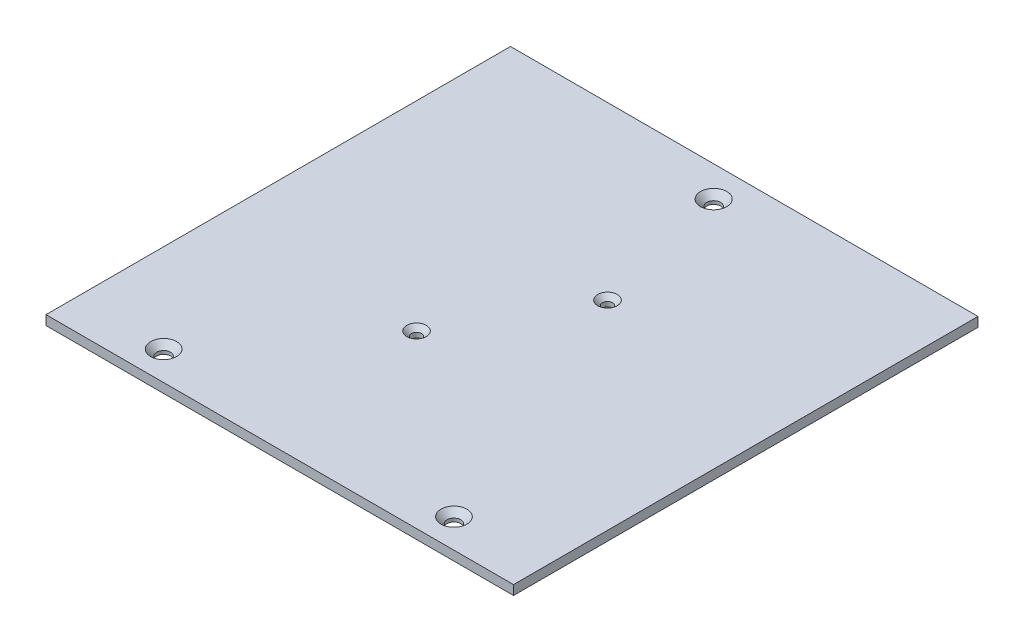
ISO-10303-21;
HEADER;
FILE_DESCRIPTION(('STEP AP214'),'2;1');
FILE_NAME('part.step','',(''),(''),'','','');
FILE_SCHEMA(('AUTOMOTIVE_DESIGN { 1 0 10303 214 1 1 1 1 }'));
ENDSEC;
DATA;
#1=APPLICATION_CONTEXT('core data for automotive mechanical design processes');
#2=APPLICATION_PROTOCOL_DEFINITION('international standard','automotive_design',2000,#1);
#3=PRODUCT_CONTEXT('',#1,'mechanical');
#4=PRODUCT('Part','Part','',(#3));
#5=PRODUCT_RELATED_PRODUCT_CATEGORY('part','',(#4));
#6=PRODUCT_DEFINITION_FORMATION('','',#4);
#7=PRODUCT_DEFINITION_CONTEXT('part definition',#1,'design');
#8=PRODUCT_DEFINITION('design','',#6,#7);
#9=PRODUCT_DEFINITION_SHAPE('','',#8);
#10=(LENGTH_UNIT() NAMED_UNIT(*) SI_UNIT(.MILLI.,.METRE.));
#11=(NAMED_UNIT(*) PLANE_ANGLE_UNIT() SI_UNIT($,.RADIAN.));
#12=(NAMED_UNIT(*) SI_UNIT($,.STERADIAN.) SOLID_ANGLE_UNIT());
#13=UNCERTAINTY_MEASURE_WITH_UNIT(LENGTH_MEASURE(1.E-05),#10,'distance_accuracy_value','');
#14=(GEOMETRIC_REPRESENTATION_CONTEXT(3) GLOBAL_UNCERTAINTY_ASSIGNED_CONTEXT((#13)) GLOBAL_UNIT_ASSIGNED_CONTEXT((#10,
#11,#12)) REPRESENTATION_CONTEXT('',''));
#15=CARTESIAN_POINT('',(0.,0.,0.));
#16=DIRECTION('',(0.,0.,1.));
#17=DIRECTION('',(1.,0.,0.));
#18=AXIS2_PLACEMENT_3D('',#15,#16,#17);
#19=CARTESIAN_POINT('',(0.,0.,0.));
#20=DIRECTION('',(0.,1.,0.));
#21=DIRECTION('',(1.,0.,0.));
#22=AXIS2_PLACEMENT_3D('',#19,#20,#21);
#23=PLANE('',#22);
#24=DIRECTION('',(-1.,0.,0.));
#25=VECTOR('',#24,1.);
#26=CARTESIAN_POINT('',(76.5,0.,-76.));
#27=LINE('',#26,#25);
#28=CARTESIAN_POINT('',(76.5,0.,-76.));
#29=VERTEX_POINT('',#28);
#30=CARTESIAN_POINT('',(-76.5,0.,-76.));
#31=VERTEX_POINT('',#30);
#32=EDGE_CURVE('E192',#29,#31,#27,.T.);
#33=ORIENTED_EDGE('',*,*,#32,.F.);
#34=DIRECTION('',(0.,0.,-1.));
#35=VECTOR('',#34,1.);
#36=CARTESIAN_POINT('',(76.5,0.,76.));
#37=LINE('',#36,#35);
#38=CARTESIAN_POINT('',(76.5,0.,76.));
#39=VERTEX_POINT('',#38);
#40=EDGE_CURVE('E36',#39,#29,#37,.T.);
#41=ORIENTED_EDGE('',*,*,#40,.F.);
#42=DIRECTION('',(1.,0.,0.));
#43=VECTOR('',#42,1.);
#44=CARTESIAN_POINT('',(-76.5,0.,76.));
#45=LINE('',#44,#43);
#46=CARTESIAN_POINT('',(-76.5,0.,76.));
#47=VERTEX_POINT('',#46);
#48=EDGE_CURVE('E74',#47,#39,#45,.T.);
#49=ORIENTED_EDGE('',*,*,#48,.F.);
#50=DIRECTION('',(0.,0.,1.));
#51=VECTOR('',#50,1.);
#52=CARTESIAN_POINT('',(-76.5,0.,-76.));
#53=LINE('',#52,#51);
#54=EDGE_CURVE('E188',#31,#47,#53,.T.);
#55=ORIENTED_EDGE('',*,*,#54,.F.);
#56=EDGE_LOOP('',(#33,#41,#49,#55));
#57=FACE_BOUND('',#56,.T.);
#58=CARTESIAN_POINT('',(47.5,0.,66.5));
#59=DIRECTION('',(0.,1.,0.));
#60=DIRECTION('',(-1.,0.,0.));
#61=AXIS2_PLACEMENT_3D('',#58,#59,#60);
#62=CIRCLE('',#61,2.25);
#63=CARTESIAN_POINT('',(45.25,0.,66.5));
#64=VERTEX_POINT('',#63);
#65=EDGE_CURVE('E11',#64,#64,#62,.T.);
#66=ORIENTED_EDGE('',*,*,#65,.T.);
#67=EDGE_LOOP('',(#66));
#68=FACE_BOUND('',#67,.T.);
#69=CARTESIAN_POINT('',(-47.5,0.,66.5));
#70=DIRECTION('',(0.,1.,0.));
#71=DIRECTION('',(-1.,0.,0.));
#72=AXIS2_PLACEMENT_3D('',#69,#70,#71);
#73=CIRCLE('',#72,2.25);
#74=CARTESIAN_POINT('',(-49.75,0.,66.5));
#75=VERTEX_POINT('',#74);
#76=EDGE_CURVE('E27',#75,#75,#73,.T.);
#77=ORIENTED_EDGE('',*,*,#76,.T.);
#78=EDGE_LOOP('',(#77));
#79=FACE_BOUND('',#78,.T.);
#80=CARTESIAN_POINT('',(0.,0.,-66.));
#81=DIRECTION('',(0.,1.,0.));
#82=DIRECTION('',(-1.,0.,0.));
#83=AXIS2_PLACEMENT_3D('',#80,#81,#82);
#84=CIRCLE('',#83,2.25);
#85=CARTESIAN_POINT('',(-2.25,0.,-66.));
#86=VERTEX_POINT('',#85);
#87=EDGE_CURVE('E174',#86,#86,#84,.T.);
#88=ORIENTED_EDGE('',*,*,#87,.T.);
#89=EDGE_LOOP('',(#88));
#90=FACE_BOUND('',#89,.T.);
#91=CARTESIAN_POINT('',(11.25,0.,-20.));
#92=DIRECTION('',(0.,1.,0.));
#93=DIRECTION('',(-1.,0.,0.));
#94=AXIS2_PLACEMENT_3D('',#91,#92,#93);
#95=CIRCLE('',#94,1.65);
#96=CARTESIAN_POINT('',(9.6,0.,-20.));
#97=VERTEX_POINT('',#96);
#98=EDGE_CURVE('E176',#97,#97,#95,.T.);
#99=ORIENTED_EDGE('',*,*,#98,.T.);
#100=EDGE_LOOP('',(#99));
#101=FACE_BOUND('',#100,.T.);
#102=CARTESIAN_POINT('',(-11.25,0.,20.));
#103=DIRECTION('',(0.,1.,0.));
#104=DIRECTION('',(-1.,0.,0.));
#105=AXIS2_PLACEMENT_3D('',#102,#103,#104);
#106=CIRCLE('',#105,1.65);
#107=CARTESIAN_POINT('',(-12.9,0.,20.));
#108=VERTEX_POINT('',#107);
#109=EDGE_CURVE('E181',#108,#108,#106,.T.);
#110=ORIENTED_EDGE('',*,*,#109,.T.);
#111=EDGE_LOOP('',(#110));
#112=FACE_BOUND('',#111,.T.);
#113=ADVANCED_FACE('F17',(#57,#68,#79,#90,#101,#112),#23,.F.);
#114=CARTESIAN_POINT('',(-76.5,0.,-76.));
#115=DIRECTION('',(-1.,0.,0.));
#116=DIRECTION('',(0.,0.,1.));
#117=AXIS2_PLACEMENT_3D('',#114,#115,#116);
#118=PLANE('',#117);
#119=DIRECTION('',(0.,1.,0.));
#120=VECTOR('',#119,1.);
#121=CARTESIAN_POINT('',(-76.5,0.,76.));
#122=LINE('',#121,#120);
#123=CARTESIAN_POINT('',(-76.5,3.1,76.));
#124=VERTEX_POINT('',#123);
#125=EDGE_CURVE('E186',#47,#124,#122,.T.);
#126=ORIENTED_EDGE('',*,*,#125,.T.);
#127=DIRECTION('',(0.,0.,1.));
#128=VECTOR('',#127,1.);
#129=CARTESIAN_POINT('',(-76.5,3.1,-76.));
#130=LINE('',#129,#128);
#131=CARTESIAN_POINT('',(-76.5,3.1,-76.));
#132=VERTEX_POINT('',#131);
#133=EDGE_CURVE('E78',#132,#124,#130,.T.);
#134=ORIENTED_EDGE('',*,*,#133,.F.);
#135=DIRECTION('',(0.,1.,0.));
#136=VECTOR('',#135,1.);
#137=CARTESIAN_POINT('',(-76.5,0.,-76.));
#138=LINE('',#137,#136);
#139=EDGE_CURVE('E190',#31,#132,#138,.T.);
#140=ORIENTED_EDGE('',*,*,#139,.F.);
#141=ORIENTED_EDGE('',*,*,#54,.T.);
#142=EDGE_LOOP('',(#126,#134,#140,#141));
#143=FACE_BOUND('',#142,.T.);
#144=ADVANCED_FACE('F129',(#143),#118,.T.);
#145=CARTESIAN_POINT('',(76.5,0.,-76.));
#146=DIRECTION('',(0.,0.,-1.));
#147=DIRECTION('',(-1.,0.,0.));
#148=AXIS2_PLACEMENT_3D('',#145,#146,#147);
#149=PLANE('',#148);
#150=ORIENTED_EDGE('',*,*,#139,.T.);
#151=DIRECTION('',(-1.,0.,0.));
#152=VECTOR('',#151,1.);
#153=CARTESIAN_POINT('',(76.5,3.1,-76.));
#154=LINE('',#153,#152);
#155=CARTESIAN_POINT('',(76.5,3.1,-76.));
#156=VERTEX_POINT('',#155);
#157=EDGE_CURVE('E58',#156,#132,#154,.T.);
#158=ORIENTED_EDGE('',*,*,#157,.F.);
#159=DIRECTION('',(0.,1.,0.));
#160=VECTOR('',#159,1.);
#161=CARTESIAN_POINT('',(76.5,0.,-76.));
#162=LINE('',#161,#160);
#163=EDGE_CURVE('E65',#29,#156,#162,.T.);
#164=ORIENTED_EDGE('',*,*,#163,.F.);
#165=ORIENTED_EDGE('',*,*,#32,.T.);
#166=EDGE_LOOP('',(#150,#158,#164,#165));
#167=FACE_BOUND('',#166,.T.);
#168=ADVANCED_FACE('F135',(#167),#149,.T.);
#169=CARTESIAN_POINT('',(76.5,0.,76.));
#170=DIRECTION('',(1.,0.,0.));
#171=DIRECTION('',(0.,0.,-1.));
#172=AXIS2_PLACEMENT_3D('',#169,#170,#171);
#173=PLANE('',#172);
#174=ORIENTED_EDGE('',*,*,#163,.T.);
#175=DIRECTION('',(0.,0.,-1.));
#176=VECTOR('',#175,1.);
#177=CARTESIAN_POINT('',(76.5,3.1,76.));
#178=LINE('',#177,#176);
#179=CARTESIAN_POINT('',(76.5,3.1,76.));
#180=VERTEX_POINT('',#179);
#181=EDGE_CURVE('E61',#180,#156,#178,.T.);
#182=ORIENTED_EDGE('',*,*,#181,.F.);
#183=DIRECTION('',(0.,1.,0.));
#184=VECTOR('',#183,1.);
#185=CARTESIAN_POINT('',(76.5,0.,76.));
#186=LINE('',#185,#184);
#187=EDGE_CURVE('E64',#39,#180,#186,.T.);
#188=ORIENTED_EDGE('',*,*,#187,.F.);
#189=ORIENTED_EDGE('',*,*,#40,.T.);
#190=EDGE_LOOP('',(#174,#182,#188,#189));
#191=FACE_BOUND('',#190,.T.);
#192=ADVANCED_FACE('F63',(#191),#173,.T.);
#193=CARTESIAN_POINT('',(-76.5,0.,76.));
#194=DIRECTION('',(0.,0.,1.));
#195=DIRECTION('',(1.,0.,0.));
#196=AXIS2_PLACEMENT_3D('',#193,#194,#195);
#197=PLANE('',#196);
#198=ORIENTED_EDGE('',*,*,#187,.T.);
#199=DIRECTION('',(1.,0.,0.));
#200=VECTOR('',#199,1.);
#201=CARTESIAN_POINT('',(-76.5,3.1,76.));
#202=LINE('',#201,#200);
#203=EDGE_CURVE('E68',#124,#180,#202,.T.);
#204=ORIENTED_EDGE('',*,*,#203,.F.);
#205=ORIENTED_EDGE('',*,*,#125,.F.);
#206=ORIENTED_EDGE('',*,*,#48,.T.);
#207=EDGE_LOOP('',(#198,#204,#205,#206));
#208=FACE_BOUND('',#207,.T.);
#209=ADVANCED_FACE('F72',(#208),#197,.T.);
#210=CARTESIAN_POINT('',(0.,3.1,0.));
#211=DIRECTION('',(0.,1.,0.));
#212=DIRECTION('',(1.,0.,0.));
#213=AXIS2_PLACEMENT_3D('',#210,#211,#212);
#214=PLANE('',#213);
#215=ORIENTED_EDGE('',*,*,#203,.T.);
#216=ORIENTED_EDGE('',*,*,#181,.T.);
#217=ORIENTED_EDGE('',*,*,#157,.T.);
#218=ORIENTED_EDGE('',*,*,#133,.T.);
#219=EDGE_LOOP('',(#215,#216,#217,#218));
#220=FACE_BOUND('',#219,.T.);
#221=CARTESIAN_POINT('',(47.5,3.1,66.5));
#222=DIRECTION('',(0.,1.,0.));
#223=DIRECTION('',(-1.,0.,0.));
#224=AXIS2_PLACEMENT_3D('',#221,#222,#223);
#225=CIRCLE('',#224,4.25);
#226=CARTESIAN_POINT('',(43.25,3.1,66.5));
#227=VERTEX_POINT('',#226);
#228=EDGE_CURVE('E83',#227,#227,#225,.T.);
#229=ORIENTED_EDGE('',*,*,#228,.F.);
#230=EDGE_LOOP('',(#229));
#231=FACE_BOUND('',#230,.T.);
#232=CARTESIAN_POINT('',(-47.5,3.1,66.5));
#233=DIRECTION('',(0.,1.,0.));
#234=DIRECTION('',(-1.,0.,0.));
#235=AXIS2_PLACEMENT_3D('',#232,#233,#234);
#236=CIRCLE('',#235,4.25);
#237=CARTESIAN_POINT('',(-51.75,3.1,66.5));
#238=VERTEX_POINT('',#237);
#239=EDGE_CURVE('E87',#238,#238,#236,.T.);
#240=ORIENTED_EDGE('',*,*,#239,.F.);
#241=EDGE_LOOP('',(#240));
#242=FACE_BOUND('',#241,.T.);
#243=CARTESIAN_POINT('',(0.,3.1,-66.));
#244=DIRECTION('',(0.,1.,0.));
#245=DIRECTION('',(-1.,0.,0.));
#246=AXIS2_PLACEMENT_3D('',#243,#244,#245);
#247=CIRCLE('',#246,4.3);
#248=CARTESIAN_POINT('',(-4.3,3.1,-66.));
#249=VERTEX_POINT('',#248);
#250=EDGE_CURVE('E91',#249,#249,#247,.T.);
#251=ORIENTED_EDGE('',*,*,#250,.F.);
#252=EDGE_LOOP('',(#251));
#253=FACE_BOUND('',#252,.T.);
#254=CARTESIAN_POINT('',(11.25,3.1,-20.));
#255=DIRECTION('',(0.,1.,0.));
#256=DIRECTION('',(-1.,0.,0.));
#257=AXIS2_PLACEMENT_3D('',#254,#255,#256);
#258=CIRCLE('',#257,3.2);
#259=CARTESIAN_POINT('',(8.05,3.1,-20.));
#260=VERTEX_POINT('',#259);
#261=EDGE_CURVE('E95',#260,#260,#258,.T.);
#262=ORIENTED_EDGE('',*,*,#261,.F.);
#263=EDGE_LOOP('',(#262));
#264=FACE_BOUND('',#263,.T.);
#265=CARTESIAN_POINT('',(-11.25,3.1,20.));
#266=DIRECTION('',(0.,1.,0.));
#267=DIRECTION('',(-1.,0.,0.));
#268=AXIS2_PLACEMENT_3D('',#265,#266,#267);
#269=CIRCLE('',#268,3.2);
#270=CARTESIAN_POINT('',(-14.45,3.1,20.));
#271=VERTEX_POINT('',#270);
#272=EDGE_CURVE('E99',#271,#271,#269,.T.);
#273=ORIENTED_EDGE('',*,*,#272,.F.);
#274=EDGE_LOOP('',(#273));
#275=FACE_BOUND('',#274,.T.);
#276=ADVANCED_FACE('F76',(#220,#231,#242,#253,#264,#275),#214,.T.);
#277=CARTESIAN_POINT('',(47.5,2.1,66.5));
#278=DIRECTION('',(0.,1.,0.));
#279=DIRECTION('',(1.,0.,0.));
#280=AXIS2_PLACEMENT_3D('',#277,#278,#279);
#281=CONICAL_SURFACE('',#280,3.25,0.7853981633973);
#282=ORIENTED_EDGE('',*,*,#228,.T.);
#283=EDGE_LOOP('',(#282));
#284=FACE_BOUND('',#283,.T.);
#285=CARTESIAN_POINT('',(47.5,1.1,66.5));
#286=DIRECTION('',(0.,1.,0.));
#287=DIRECTION('',(1.,0.,0.));
#288=AXIS2_PLACEMENT_3D('',#285,#286,#287);
#289=CIRCLE('',#288,2.25);
#290=CARTESIAN_POINT('',(49.75,1.1,66.5));
#291=VERTEX_POINT('',#290);
#292=EDGE_CURVE('E86',#291,#291,#289,.T.);
#293=ORIENTED_EDGE('',*,*,#292,.F.);
#294=EDGE_LOOP('',(#293));
#295=FACE_BOUND('',#294,.T.);
#296=ADVANCED_FACE('F148',(#284,#295),#281,.F.);
#297=CARTESIAN_POINT('',(47.5,-0.4805,66.5));
#298=DIRECTION('',(0.,1.,0.));
#299=DIRECTION('',(1.,0.,0.));
#300=AXIS2_PLACEMENT_3D('',#297,#298,#299);
#301=CYLINDRICAL_SURFACE('',#300,2.25);
#302=ORIENTED_EDGE('',*,*,#292,.T.);
#303=EDGE_LOOP('',(#302));
#304=FACE_BOUND('',#303,.T.);
#305=ORIENTED_EDGE('',*,*,#65,.F.);
#306=EDGE_LOOP('',(#305));
#307=FACE_BOUND('',#306,.T.);
#308=ADVANCED_FACE('F151',(#304,#307),#301,.F.);
#309=CARTESIAN_POINT('',(-47.5,2.1,66.5));
#310=DIRECTION('',(0.,1.,0.));
#311=DIRECTION('',(1.,0.,0.));
#312=AXIS2_PLACEMENT_3D('',#309,#310,#311);
#313=CONICAL_SURFACE('',#312,3.25,0.7853981633973);
#314=ORIENTED_EDGE('',*,*,#239,.T.);
#315=EDGE_LOOP('',(#314));
#316=FACE_BOUND('',#315,.T.);
#317=CARTESIAN_POINT('',(-47.5,1.1,66.5));
#318=DIRECTION('',(0.,1.,0.));
#319=DIRECTION('',(1.,0.,0.));
#320=AXIS2_PLACEMENT_3D('',#317,#318,#319);
#321=CIRCLE('',#320,2.25);
#322=CARTESIAN_POINT('',(-45.25,1.1,66.5));
#323=VERTEX_POINT('',#322);
#324=EDGE_CURVE('E90',#323,#323,#321,.T.);
#325=ORIENTED_EDGE('',*,*,#324,.F.);
#326=EDGE_LOOP('',(#325));
#327=FACE_BOUND('',#326,.T.);
#328=ADVANCED_FACE('F155',(#316,#327),#313,.F.);
#329=CARTESIAN_POINT('',(-47.5,-0.4805,66.5));
#330=DIRECTION('',(0.,1.,0.));
#331=DIRECTION('',(1.,0.,0.));
#332=AXIS2_PLACEMENT_3D('',#329,#330,#331);
#333=CYLINDRICAL_SURFACE('',#332,2.25);
#334=ORIENTED_EDGE('',*,*,#324,.T.);
#335=EDGE_LOOP('',(#334));
#336=FACE_BOUND('',#335,.T.);
#337=ORIENTED_EDGE('',*,*,#76,.F.);
#338=EDGE_LOOP('',(#337));
#339=FACE_BOUND('',#338,.T.);
#340=ADVANCED_FACE('F159',(#336,#339),#333,.F.);
#341=CARTESIAN_POINT('',(0.,2.075,-66.));
#342=DIRECTION('',(0.,1.,0.));
#343=DIRECTION('',(1.,0.,0.));
#344=AXIS2_PLACEMENT_3D('',#341,#342,#343);
#345=CONICAL_SURFACE('',#344,3.275,0.7853981633973);
#346=ORIENTED_EDGE('',*,*,#250,.T.);
#347=EDGE_LOOP('',(#346));
#348=FACE_BOUND('',#347,.T.);
#349=CARTESIAN_POINT('',(0.,1.05,-66.));
#350=DIRECTION('',(0.,1.,0.));
#351=DIRECTION('',(1.,0.,0.));
#352=AXIS2_PLACEMENT_3D('',#349,#350,#351);
#353=CIRCLE('',#352,2.25);
#354=CARTESIAN_POINT('',(2.25,1.05,-66.));
#355=VERTEX_POINT('',#354);
#356=EDGE_CURVE('E94',#355,#355,#353,.T.);
#357=ORIENTED_EDGE('',*,*,#356,.F.);
#358=EDGE_LOOP('',(#357));
#359=FACE_BOUND('',#358,.T.);
#360=ADVANCED_FACE('F125',(#348,#359),#345,.F.);
#361=CARTESIAN_POINT('',(0.,-0.4805,-66.));
#362=DIRECTION('',(0.,1.,0.));
#363=DIRECTION('',(1.,0.,0.));
#364=AXIS2_PLACEMENT_3D('',#361,#362,#363);
#365=CYLINDRICAL_SURFACE('',#364,2.25);
#366=ORIENTED_EDGE('',*,*,#356,.T.);
#367=EDGE_LOOP('',(#366));
#368=FACE_BOUND('',#367,.T.);
#369=ORIENTED_EDGE('',*,*,#87,.F.);
#370=EDGE_LOOP('',(#369));
#371=FACE_BOUND('',#370,.T.);
#372=ADVANCED_FACE('F115',(#368,#371),#365,.F.);
#373=CARTESIAN_POINT('',(11.25,2.325,-20.));
#374=DIRECTION('',(0.,1.,0.));
#375=DIRECTION('',(1.,0.,0.));
#376=AXIS2_PLACEMENT_3D('',#373,#374,#375);
#377=CONICAL_SURFACE('',#376,2.425,0.7853981633973);
#378=ORIENTED_EDGE('',*,*,#261,.T.);
#379=EDGE_LOOP('',(#378));
#380=FACE_BOUND('',#379,.T.);
#381=CARTESIAN_POINT('',(11.25,1.55,-20.));
#382=DIRECTION('',(0.,1.,0.));
#383=DIRECTION('',(1.,0.,0.));
#384=AXIS2_PLACEMENT_3D('',#381,#382,#383);
#385=CIRCLE('',#384,1.65);
#386=CARTESIAN_POINT('',(12.9,1.55,-20.));
#387=VERTEX_POINT('',#386);
#388=EDGE_CURVE('E98',#387,#387,#385,.T.);
#389=ORIENTED_EDGE('',*,*,#388,.F.);
#390=EDGE_LOOP('',(#389));
#391=FACE_BOUND('',#390,.T.);
#392=ADVANCED_FACE('F113',(#380,#391),#377,.F.);
#393=CARTESIAN_POINT('',(11.25,-0.4805,-20.));
#394=DIRECTION('',(0.,1.,0.));
#395=DIRECTION('',(1.,0.,0.));
#396=AXIS2_PLACEMENT_3D('',#393,#394,#395);
#397=CYLINDRICAL_SURFACE('',#396,1.65);
#398=ORIENTED_EDGE('',*,*,#388,.T.);
#399=EDGE_LOOP('',(#398));
#400=FACE_BOUND('',#399,.T.);
#401=ORIENTED_EDGE('',*,*,#98,.F.);
#402=EDGE_LOOP('',(#401));
#403=FACE_BOUND('',#402,.T.);
#404=ADVANCED_FACE('F110',(#400,#403),#397,.F.);
#405=CARTESIAN_POINT('',(-11.25,2.325,20.));
#406=DIRECTION('',(0.,1.,0.));
#407=DIRECTION('',(1.,0.,0.));
#408=AXIS2_PLACEMENT_3D('',#405,#406,#407);
#409=CONICAL_SURFACE('',#408,2.425,0.7853981633973);
#410=ORIENTED_EDGE('',*,*,#272,.T.);
#411=EDGE_LOOP('',(#410));
#412=FACE_BOUND('',#411,.T.);
#413=CARTESIAN_POINT('',(-11.25,1.55,20.));
#414=DIRECTION('',(0.,1.,0.));
#415=DIRECTION('',(1.,0.,0.));
#416=AXIS2_PLACEMENT_3D('',#413,#414,#415);
#417=CIRCLE('',#416,1.65);
#418=CARTESIAN_POINT('',(-9.6,1.55,20.));
#419=VERTEX_POINT('',#418);
#420=EDGE_CURVE('E21',#419,#419,#417,.T.);
#421=ORIENTED_EDGE('',*,*,#420,.F.);
#422=EDGE_LOOP('',(#421));
#423=FACE_BOUND('',#422,.T.);
#424=ADVANCED_FACE('F123',(#412,#423),#409,.F.);
#425=CARTESIAN_POINT('',(-11.25,-0.4805,20.));
#426=DIRECTION('',(0.,1.,0.));
#427=DIRECTION('',(1.,0.,0.));
#428=AXIS2_PLACEMENT_3D('',#425,#426,#427);
#429=CYLINDRICAL_SURFACE('',#428,1.65);
#430=ORIENTED_EDGE('',*,*,#420,.T.);
#431=EDGE_LOOP('',(#430));
#432=FACE_BOUND('',#431,.T.);
#433=ORIENTED_EDGE('',*,*,#109,.F.);
#434=EDGE_LOOP('',(#433));
#435=FACE_BOUND('',#434,.T.);
#436=ADVANCED_FACE('F19',(#432,#435),#429,.F.);
#437=CLOSED_SHELL('',(#113,#144,#168,#192,#209,#276,#296,#308,#328,#340,#360,#372,#392,#404,
#424,#436));
#438=MANIFOLD_SOLID_BREP('B1',#437);
#439=ADVANCED_BREP_SHAPE_REPRESENTATION('',(#18,#438),#14);
#440=SHAPE_DEFINITION_REPRESENTATION(#9,#439);
ENDSEC;
END-ISO-10303-21;
